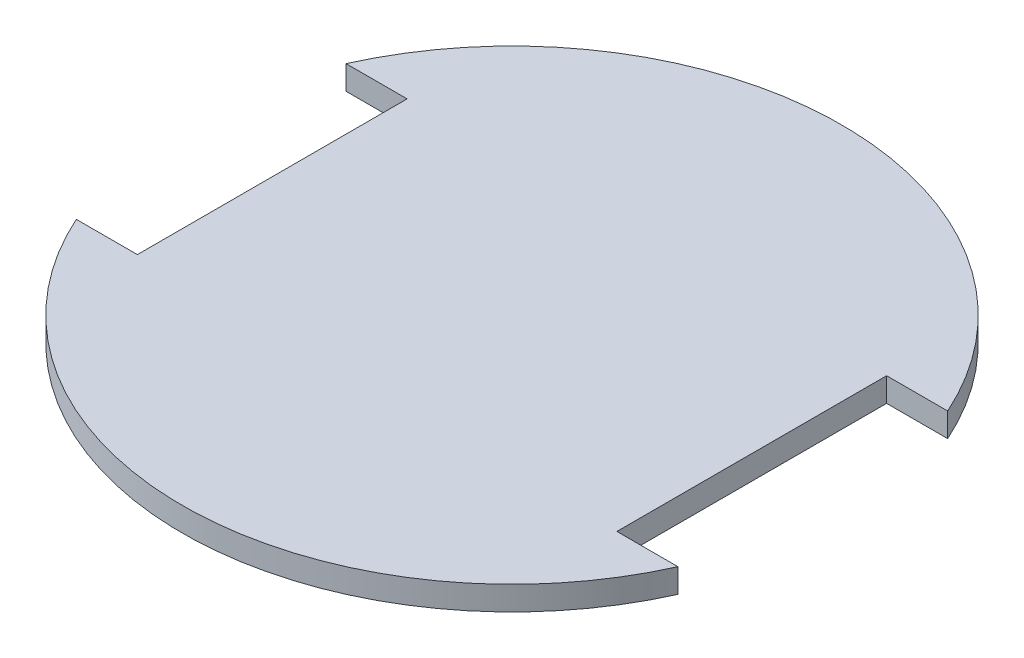
ISO-10303-21;
HEADER;
FILE_DESCRIPTION(('STEP AP214'),'2;1');
FILE_NAME('part.step','',(''),(''),'','','');
FILE_SCHEMA(('AUTOMOTIVE_DESIGN { 1 0 10303 214 1 1 1 1 }'));
ENDSEC;
DATA;
#1=APPLICATION_CONTEXT('core data for automotive mechanical design processes');
#2=APPLICATION_PROTOCOL_DEFINITION('international standard','automotive_design',2000,#1);
#3=PRODUCT_CONTEXT('',#1,'mechanical');
#4=PRODUCT('Part','Part','',(#3));
#5=PRODUCT_RELATED_PRODUCT_CATEGORY('part','',(#4));
#6=PRODUCT_DEFINITION_FORMATION('','',#4);
#7=PRODUCT_DEFINITION_CONTEXT('part definition',#1,'design');
#8=PRODUCT_DEFINITION('design','',#6,#7);
#9=PRODUCT_DEFINITION_SHAPE('','',#8);
#10=(LENGTH_UNIT() NAMED_UNIT(*) SI_UNIT(.MILLI.,.METRE.));
#11=(NAMED_UNIT(*) PLANE_ANGLE_UNIT() SI_UNIT($,.RADIAN.));
#12=(NAMED_UNIT(*) SI_UNIT($,.STERADIAN.) SOLID_ANGLE_UNIT());
#13=UNCERTAINTY_MEASURE_WITH_UNIT(LENGTH_MEASURE(1.E-05),#10,'distance_accuracy_value','');
#14=(GEOMETRIC_REPRESENTATION_CONTEXT(3) GLOBAL_UNCERTAINTY_ASSIGNED_CONTEXT((#13)) GLOBAL_UNIT_ASSIGNED_CONTEXT((#10,
#11,#12)) REPRESENTATION_CONTEXT('',''));
#15=CARTESIAN_POINT('',(0.,0.,0.));
#16=DIRECTION('',(0.,0.,1.));
#17=DIRECTION('',(1.,0.,0.));
#18=AXIS2_PLACEMENT_3D('',#15,#16,#17);
#19=CARTESIAN_POINT('',(-80.,8.,-45.));
#20=DIRECTION('',(0.,0.,-1.));
#21=DIRECTION('',(-1.,0.,0.));
#22=AXIS2_PLACEMENT_3D('',#19,#20,#21);
#23=PLANE('',#22);
#24=DIRECTION('',(1.,0.,0.));
#25=VECTOR('',#24,1.);
#26=CARTESIAN_POINT('',(-80.,0.,-45.));
#27=LINE('',#26,#25);
#28=CARTESIAN_POINT('',(-100.374299499424,0.,-45.));
#29=VERTEX_POINT('',#28);
#30=CARTESIAN_POINT('',(-80.,0.,-45.));
#31=VERTEX_POINT('',#30);
#32=EDGE_CURVE('E131',#29,#31,#27,.T.);
#33=ORIENTED_EDGE('',*,*,#32,.T.);
#34=DIRECTION('',(0.,-1.,0.));
#35=VECTOR('',#34,1.);
#36=CARTESIAN_POINT('',(-80.,8.,-45.));
#37=LINE('',#36,#35);
#38=CARTESIAN_POINT('',(-80.,8.,-45.));
#39=VERTEX_POINT('',#38);
#40=EDGE_CURVE('E11',#39,#31,#37,.T.);
#41=ORIENTED_EDGE('',*,*,#40,.F.);
#42=DIRECTION('',(1.,0.,0.));
#43=VECTOR('',#42,1.);
#44=CARTESIAN_POINT('',(-80.,8.,-45.));
#45=LINE('',#44,#43);
#46=CARTESIAN_POINT('',(-100.374299499424,8.,-45.));
#47=VERTEX_POINT('',#46);
#48=EDGE_CURVE('E145',#47,#39,#45,.T.);
#49=ORIENTED_EDGE('',*,*,#48,.F.);
#50=DIRECTION('',(0.,-1.,0.));
#51=VECTOR('',#50,1.);
#52=CARTESIAN_POINT('',(-100.374299499424,8.,-45.));
#53=LINE('',#52,#51);
#54=EDGE_CURVE('E127',#47,#29,#53,.T.);
#55=ORIENTED_EDGE('',*,*,#54,.T.);
#56=EDGE_LOOP('',(#33,#41,#49,#55));
#57=FACE_BOUND('',#56,.T.);
#58=ADVANCED_FACE('F35',(#57),#23,.F.);
#59=CARTESIAN_POINT('',(-80.,8.,-45.));
#60=DIRECTION('',(1.,0.,0.));
#61=DIRECTION('',(0.,0.,-1.));
#62=AXIS2_PLACEMENT_3D('',#59,#60,#61);
#63=PLANE('',#62);
#64=DIRECTION('',(0.,0.,1.));
#65=VECTOR('',#64,1.);
#66=CARTESIAN_POINT('',(-80.,0.,-45.));
#67=LINE('',#66,#65);
#68=CARTESIAN_POINT('',(-80.,0.,45.));
#69=VERTEX_POINT('',#68);
#70=EDGE_CURVE('E134',#31,#69,#67,.T.);
#71=ORIENTED_EDGE('',*,*,#70,.T.);
#72=DIRECTION('',(0.,-1.,0.));
#73=VECTOR('',#72,1.);
#74=CARTESIAN_POINT('',(-80.,8.,45.));
#75=LINE('',#74,#73);
#76=CARTESIAN_POINT('',(-80.,8.,45.));
#77=VERTEX_POINT('',#76);
#78=EDGE_CURVE('E43',#77,#69,#75,.T.);
#79=ORIENTED_EDGE('',*,*,#78,.F.);
#80=DIRECTION('',(0.,0.,1.));
#81=VECTOR('',#80,1.);
#82=CARTESIAN_POINT('',(-80.,8.,-45.));
#83=LINE('',#82,#81);
#84=EDGE_CURVE('E94',#39,#77,#83,.T.);
#85=ORIENTED_EDGE('',*,*,#84,.F.);
#86=ORIENTED_EDGE('',*,*,#40,.T.);
#87=EDGE_LOOP('',(#71,#79,#85,#86));
#88=FACE_BOUND('',#87,.T.);
#89=ADVANCED_FACE('F180',(#88),#63,.F.);
#90=CARTESIAN_POINT('',(-80.,8.,45.));
#91=DIRECTION('',(0.,0.,1.));
#92=DIRECTION('',(1.,0.,0.));
#93=AXIS2_PLACEMENT_3D('',#90,#91,#92);
#94=PLANE('',#93);
#95=DIRECTION('',(-1.,0.,0.));
#96=VECTOR('',#95,1.);
#97=CARTESIAN_POINT('',(-80.,0.,45.));
#98=LINE('',#97,#96);
#99=CARTESIAN_POINT('',(-100.374299499424,0.,45.));
#100=VERTEX_POINT('',#99);
#101=EDGE_CURVE('E136',#69,#100,#98,.T.);
#102=ORIENTED_EDGE('',*,*,#101,.T.);
#103=DIRECTION('',(0.,-1.,0.));
#104=VECTOR('',#103,1.);
#105=CARTESIAN_POINT('',(-100.374299499424,8.,45.));
#106=LINE('',#105,#104);
#107=CARTESIAN_POINT('',(-100.374299499424,8.,45.));
#108=VERTEX_POINT('',#107);
#109=EDGE_CURVE('E152',#108,#100,#106,.T.);
#110=ORIENTED_EDGE('',*,*,#109,.F.);
#111=DIRECTION('',(-1.,0.,0.));
#112=VECTOR('',#111,1.);
#113=CARTESIAN_POINT('',(-80.,8.,45.));
#114=LINE('',#113,#112);
#115=EDGE_CURVE('E160',#77,#108,#114,.T.);
#116=ORIENTED_EDGE('',*,*,#115,.F.);
#117=ORIENTED_EDGE('',*,*,#78,.T.);
#118=EDGE_LOOP('',(#102,#110,#116,#117));
#119=FACE_BOUND('',#118,.T.);
#120=ADVANCED_FACE('F158',(#119),#94,.F.);
#121=CARTESIAN_POINT('',(0.,8.,0.));
#122=DIRECTION('',(0.,-1.,0.));
#123=DIRECTION('',(0.,0.,-1.));
#124=AXIS2_PLACEMENT_3D('',#121,#122,#123);
#125=CYLINDRICAL_SURFACE('',#124,110.);
#126=CARTESIAN_POINT('',(0.,0.,0.));
#127=DIRECTION('',(0.,1.,0.));
#128=DIRECTION('',(0.,0.,-1.));
#129=AXIS2_PLACEMENT_3D('',#126,#127,#128);
#130=CIRCLE('',#129,110.);
#131=CARTESIAN_POINT('',(100.374299499424,0.,45.));
#132=VERTEX_POINT('',#131);
#133=EDGE_CURVE('E138',#100,#132,#130,.T.);
#134=ORIENTED_EDGE('',*,*,#133,.T.);
#135=DIRECTION('',(0.,-1.,0.));
#136=VECTOR('',#135,1.);
#137=CARTESIAN_POINT('',(100.374299499424,8.,45.));
#138=LINE('',#137,#136);
#139=CARTESIAN_POINT('',(100.374299499424,8.,45.));
#140=VERTEX_POINT('',#139);
#141=EDGE_CURVE('E149',#140,#132,#138,.T.);
#142=ORIENTED_EDGE('',*,*,#141,.F.);
#143=CARTESIAN_POINT('',(0.,8.,0.));
#144=DIRECTION('',(0.,1.,0.));
#145=DIRECTION('',(0.,0.,-1.));
#146=AXIS2_PLACEMENT_3D('',#143,#144,#145);
#147=CIRCLE('',#146,110.);
#148=EDGE_CURVE('E172',#108,#140,#147,.T.);
#149=ORIENTED_EDGE('',*,*,#148,.F.);
#150=ORIENTED_EDGE('',*,*,#109,.T.);
#151=EDGE_LOOP('',(#134,#142,#149,#150));
#152=FACE_BOUND('',#151,.T.);
#153=ADVANCED_FACE('F168',(#152),#125,.T.);
#154=CARTESIAN_POINT('',(80.,8.,45.));
#155=DIRECTION('',(0.,0.,1.));
#156=DIRECTION('',(1.,0.,0.));
#157=AXIS2_PLACEMENT_3D('',#154,#155,#156);
#158=PLANE('',#157);
#159=DIRECTION('',(-1.,0.,0.));
#160=VECTOR('',#159,1.);
#161=CARTESIAN_POINT('',(80.,0.,45.));
#162=LINE('',#161,#160);
#163=CARTESIAN_POINT('',(80.,0.,45.));
#164=VERTEX_POINT('',#163);
#165=EDGE_CURVE('E140',#132,#164,#162,.T.);
#166=ORIENTED_EDGE('',*,*,#165,.T.);
#167=DIRECTION('',(0.,-1.,0.));
#168=VECTOR('',#167,1.);
#169=CARTESIAN_POINT('',(80.,8.,45.));
#170=LINE('',#169,#168);
#171=CARTESIAN_POINT('',(80.,8.,45.));
#172=VERTEX_POINT('',#171);
#173=EDGE_CURVE('E122',#172,#164,#170,.T.);
#174=ORIENTED_EDGE('',*,*,#173,.F.);
#175=DIRECTION('',(-1.,0.,0.));
#176=VECTOR('',#175,1.);
#177=CARTESIAN_POINT('',(80.,8.,45.));
#178=LINE('',#177,#176);
#179=EDGE_CURVE('E113',#140,#172,#178,.T.);
#180=ORIENTED_EDGE('',*,*,#179,.F.);
#181=ORIENTED_EDGE('',*,*,#141,.T.);
#182=EDGE_LOOP('',(#166,#174,#180,#181));
#183=FACE_BOUND('',#182,.T.);
#184=ADVANCED_FACE('F171',(#183),#158,.F.);
#185=CARTESIAN_POINT('',(80.,8.,-45.));
#186=DIRECTION('',(-1.,0.,0.));
#187=DIRECTION('',(0.,0.,1.));
#188=AXIS2_PLACEMENT_3D('',#185,#186,#187);
#189=PLANE('',#188);
#190=DIRECTION('',(0.,0.,-1.));
#191=VECTOR('',#190,1.);
#192=CARTESIAN_POINT('',(80.,0.,-45.));
#193=LINE('',#192,#191);
#194=CARTESIAN_POINT('',(80.,0.,-45.));
#195=VERTEX_POINT('',#194);
#196=EDGE_CURVE('E121',#164,#195,#193,.T.);
#197=ORIENTED_EDGE('',*,*,#196,.T.);
#198=DIRECTION('',(0.,-1.,0.));
#199=VECTOR('',#198,1.);
#200=CARTESIAN_POINT('',(80.,8.,-45.));
#201=LINE('',#200,#199);
#202=CARTESIAN_POINT('',(80.,8.,-45.));
#203=VERTEX_POINT('',#202);
#204=EDGE_CURVE('E118',#203,#195,#201,.T.);
#205=ORIENTED_EDGE('',*,*,#204,.F.);
#206=DIRECTION('',(0.,0.,-1.));
#207=VECTOR('',#206,1.);
#208=CARTESIAN_POINT('',(80.,8.,-45.));
#209=LINE('',#208,#207);
#210=EDGE_CURVE('E107',#172,#203,#209,.T.);
#211=ORIENTED_EDGE('',*,*,#210,.F.);
#212=ORIENTED_EDGE('',*,*,#173,.T.);
#213=EDGE_LOOP('',(#197,#205,#211,#212));
#214=FACE_BOUND('',#213,.T.);
#215=ADVANCED_FACE('F119',(#214),#189,.F.);
#216=CARTESIAN_POINT('',(80.,8.,-45.));
#217=DIRECTION('',(0.,0.,-1.));
#218=DIRECTION('',(-1.,0.,0.));
#219=AXIS2_PLACEMENT_3D('',#216,#217,#218);
#220=PLANE('',#219);
#221=DIRECTION('',(1.,0.,0.));
#222=VECTOR('',#221,1.);
#223=CARTESIAN_POINT('',(80.,0.,-45.));
#224=LINE('',#223,#222);
#225=CARTESIAN_POINT('',(100.374299499424,0.,-45.));
#226=VERTEX_POINT('',#225);
#227=EDGE_CURVE('E80',#195,#226,#224,.T.);
#228=ORIENTED_EDGE('',*,*,#227,.T.);
#229=DIRECTION('',(0.,-1.,0.));
#230=VECTOR('',#229,1.);
#231=CARTESIAN_POINT('',(100.374299499424,8.,-45.));
#232=LINE('',#231,#230);
#233=CARTESIAN_POINT('',(100.374299499424,8.,-45.));
#234=VERTEX_POINT('',#233);
#235=EDGE_CURVE('E123',#234,#226,#232,.T.);
#236=ORIENTED_EDGE('',*,*,#235,.F.);
#237=DIRECTION('',(1.,0.,0.));
#238=VECTOR('',#237,1.);
#239=CARTESIAN_POINT('',(80.,8.,-45.));
#240=LINE('',#239,#238);
#241=EDGE_CURVE('E111',#203,#234,#240,.T.);
#242=ORIENTED_EDGE('',*,*,#241,.F.);
#243=ORIENTED_EDGE('',*,*,#204,.T.);
#244=EDGE_LOOP('',(#228,#236,#242,#243));
#245=FACE_BOUND('',#244,.T.);
#246=ADVANCED_FACE('F125',(#245),#220,.F.);
#247=CARTESIAN_POINT('',(0.,8.,0.));
#248=DIRECTION('',(0.,-1.,0.));
#249=DIRECTION('',(0.,0.,-1.));
#250=AXIS2_PLACEMENT_3D('',#247,#248,#249);
#251=CYLINDRICAL_SURFACE('',#250,110.);
#252=CARTESIAN_POINT('',(0.,0.,0.));
#253=DIRECTION('',(0.,1.,0.));
#254=DIRECTION('',(0.,0.,-1.));
#255=AXIS2_PLACEMENT_3D('',#252,#253,#254);
#256=CIRCLE('',#255,110.);
#257=EDGE_CURVE('E86',#226,#29,#256,.T.);
#258=ORIENTED_EDGE('',*,*,#257,.T.);
#259=ORIENTED_EDGE('',*,*,#54,.F.);
#260=CARTESIAN_POINT('',(0.,8.,0.));
#261=DIRECTION('',(0.,1.,0.));
#262=DIRECTION('',(0.,0.,-1.));
#263=AXIS2_PLACEMENT_3D('',#260,#261,#262);
#264=CIRCLE('',#263,110.);
#265=EDGE_CURVE('E51',#234,#47,#264,.T.);
#266=ORIENTED_EDGE('',*,*,#265,.F.);
#267=ORIENTED_EDGE('',*,*,#235,.T.);
#268=EDGE_LOOP('',(#258,#259,#266,#267));
#269=FACE_BOUND('',#268,.T.);
#270=ADVANCED_FACE('F196',(#269),#251,.T.);
#271=CARTESIAN_POINT('',(0.,8.,0.));
#272=DIRECTION('',(0.,-1.,0.));
#273=DIRECTION('',(0.,0.,-1.));
#274=AXIS2_PLACEMENT_3D('',#271,#272,#273);
#275=PLANE('',#274);
#276=ORIENTED_EDGE('',*,*,#48,.T.);
#277=ORIENTED_EDGE('',*,*,#84,.T.);
#278=ORIENTED_EDGE('',*,*,#115,.T.);
#279=ORIENTED_EDGE('',*,*,#148,.T.);
#280=ORIENTED_EDGE('',*,*,#179,.T.);
#281=ORIENTED_EDGE('',*,*,#210,.T.);
#282=ORIENTED_EDGE('',*,*,#241,.T.);
#283=ORIENTED_EDGE('',*,*,#265,.T.);
#284=EDGE_LOOP('',(#276,#277,#278,#279,#280,#281,#282,#283));
#285=FACE_BOUND('',#284,.T.);
#286=ADVANCED_FACE('F109',(#285),#275,.F.);
#287=CARTESIAN_POINT('',(0.,0.,0.));
#288=DIRECTION('',(0.,-1.,0.));
#289=DIRECTION('',(0.,0.,-1.));
#290=AXIS2_PLACEMENT_3D('',#287,#288,#289);
#291=PLANE('',#290);
#292=ORIENTED_EDGE('',*,*,#32,.F.);
#293=ORIENTED_EDGE('',*,*,#257,.F.);
#294=ORIENTED_EDGE('',*,*,#227,.F.);
#295=ORIENTED_EDGE('',*,*,#196,.F.);
#296=ORIENTED_EDGE('',*,*,#165,.F.);
#297=ORIENTED_EDGE('',*,*,#133,.F.);
#298=ORIENTED_EDGE('',*,*,#101,.F.);
#299=ORIENTED_EDGE('',*,*,#70,.F.);
#300=EDGE_LOOP('',(#292,#293,#294,#295,#296,#297,#298,#299));
#301=FACE_BOUND('',#300,.T.);
#302=ADVANCED_FACE('F164',(#301),#291,.T.);
#303=CLOSED_SHELL('',(#58,#89,#120,#153,#184,#215,#246,#270,#286,#302));
#304=MANIFOLD_SOLID_BREP('B2',#303);
#305=ADVANCED_BREP_SHAPE_REPRESENTATION('',(#18,#304),#14);
#306=SHAPE_DEFINITION_REPRESENTATION(#9,#305);
ENDSEC;
END-ISO-10303-21;
